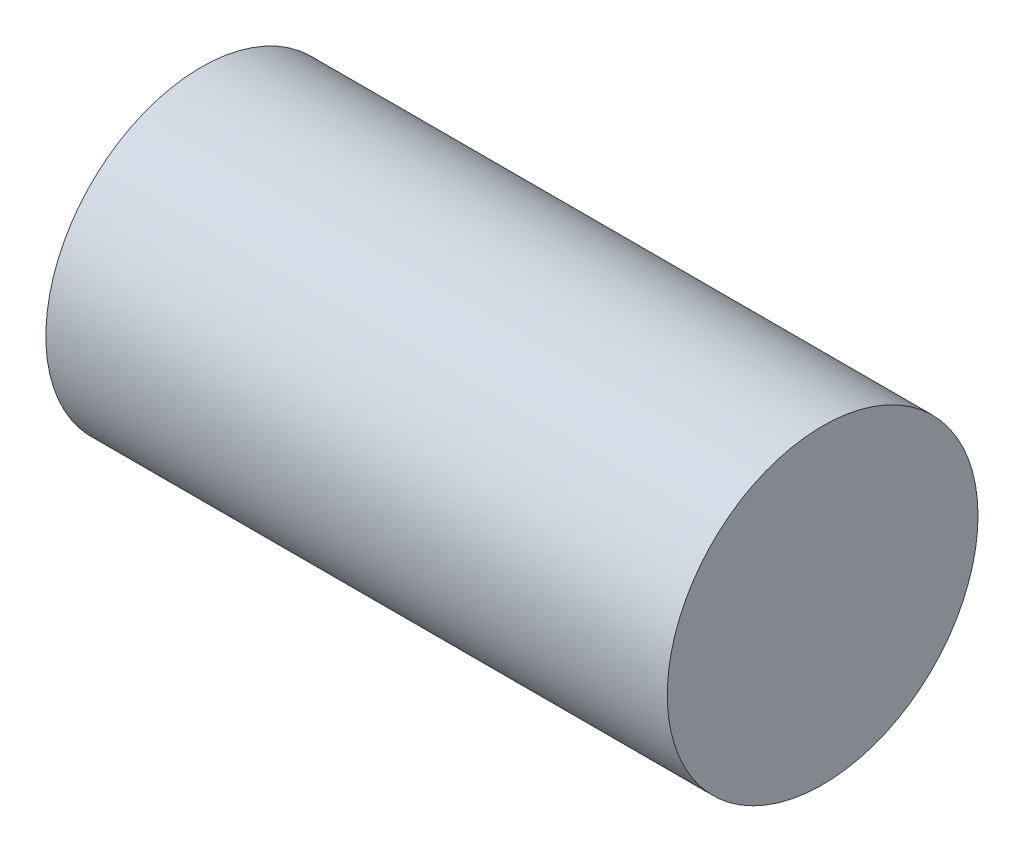
ISO-10303-21;
HEADER;
FILE_DESCRIPTION(('STEP AP214'),'2;1');
FILE_NAME('part.step','',(''),(''),'','','');
FILE_SCHEMA(('AUTOMOTIVE_DESIGN { 1 0 10303 214 1 1 1 1 }'));
ENDSEC;
DATA;
#1=APPLICATION_CONTEXT('core data for automotive mechanical design processes');
#2=APPLICATION_PROTOCOL_DEFINITION('international standard','automotive_design',2000,#1);
#3=PRODUCT_CONTEXT('',#1,'mechanical');
#4=PRODUCT('Part','Part','',(#3));
#5=PRODUCT_RELATED_PRODUCT_CATEGORY('part','',(#4));
#6=PRODUCT_DEFINITION_FORMATION('','',#4);
#7=PRODUCT_DEFINITION_CONTEXT('part definition',#1,'design');
#8=PRODUCT_DEFINITION('design','',#6,#7);
#9=PRODUCT_DEFINITION_SHAPE('','',#8);
#10=(LENGTH_UNIT() NAMED_UNIT(*) SI_UNIT(.MILLI.,.METRE.));
#11=(NAMED_UNIT(*) PLANE_ANGLE_UNIT() SI_UNIT($,.RADIAN.));
#12=(NAMED_UNIT(*) SI_UNIT($,.STERADIAN.) SOLID_ANGLE_UNIT());
#13=UNCERTAINTY_MEASURE_WITH_UNIT(LENGTH_MEASURE(1.E-05),#10,'distance_accuracy_value','');
#14=(GEOMETRIC_REPRESENTATION_CONTEXT(3) GLOBAL_UNCERTAINTY_ASSIGNED_CONTEXT((#13)) GLOBAL_UNIT_ASSIGNED_CONTEXT((#10,
#11,#12)) REPRESENTATION_CONTEXT('',''));
#15=CARTESIAN_POINT('',(0.,0.,0.));
#16=DIRECTION('',(0.,0.,1.));
#17=DIRECTION('',(1.,0.,0.));
#18=AXIS2_PLACEMENT_3D('',#15,#16,#17);
#19=CARTESIAN_POINT('',(80.,0.,0.));
#20=DIRECTION('',(-1.,0.,0.));
#21=DIRECTION('',(0.,0.,1.));
#22=AXIS2_PLACEMENT_3D('',#19,#20,#21);
#23=CYLINDRICAL_SURFACE('',#22,20.);
#24=CARTESIAN_POINT('',(80.,0.,0.));
#25=DIRECTION('',(1.,0.,0.));
#26=DIRECTION('',(0.,0.,-1.));
#27=AXIS2_PLACEMENT_3D('',#24,#25,#26);
#28=CIRCLE('',#27,20.);
#29=CARTESIAN_POINT('',(80.,0.,-20.));
#30=VERTEX_POINT('',#29);
#31=EDGE_CURVE('E10',#30,#30,#28,.T.);
#32=ORIENTED_EDGE('',*,*,#31,.F.);
#33=EDGE_LOOP('',(#32));
#34=FACE_BOUND('',#33,.T.);
#35=CARTESIAN_POINT('',(0.,0.,0.));
#36=DIRECTION('',(1.,0.,0.));
#37=DIRECTION('',(0.,0.,-1.));
#38=AXIS2_PLACEMENT_3D('',#35,#36,#37);
#39=CIRCLE('',#38,20.);
#40=CARTESIAN_POINT('',(0.,0.,-20.));
#41=VERTEX_POINT('',#40);
#42=EDGE_CURVE('E37',#41,#41,#39,.T.);
#43=ORIENTED_EDGE('',*,*,#42,.T.);
#44=EDGE_LOOP('',(#43));
#45=FACE_BOUND('',#44,.T.);
#46=ADVANCED_FACE('F40',(#34,#45),#23,.T.);
#47=CARTESIAN_POINT('',(80.,0.,0.));
#48=DIRECTION('',(1.,0.,0.));
#49=DIRECTION('',(0.,0.,-1.));
#50=AXIS2_PLACEMENT_3D('',#47,#48,#49);
#51=PLANE('',#50);
#52=ORIENTED_EDGE('',*,*,#31,.T.);
#53=EDGE_LOOP('',(#52));
#54=FACE_BOUND('',#53,.T.);
#55=ADVANCED_FACE('F55',(#54),#51,.T.);
#56=CARTESIAN_POINT('',(0.,0.,0.));
#57=DIRECTION('',(1.,0.,0.));
#58=DIRECTION('',(0.,0.,-1.));
#59=AXIS2_PLACEMENT_3D('',#56,#57,#58);
#60=PLANE('',#59);
#61=ORIENTED_EDGE('',*,*,#42,.F.);
#62=EDGE_LOOP('',(#61));
#63=FACE_BOUND('',#62,.T.);
#64=ADVANCED_FACE('F49',(#63),#60,.F.);
#65=CLOSED_SHELL('',(#46,#55,#64));
#66=MANIFOLD_SOLID_BREP('B2',#65);
#67=ADVANCED_BREP_SHAPE_REPRESENTATION('',(#18,#66),#14);
#68=SHAPE_DEFINITION_REPRESENTATION(#9,#67);
ENDSEC;
END-ISO-10303-21;
